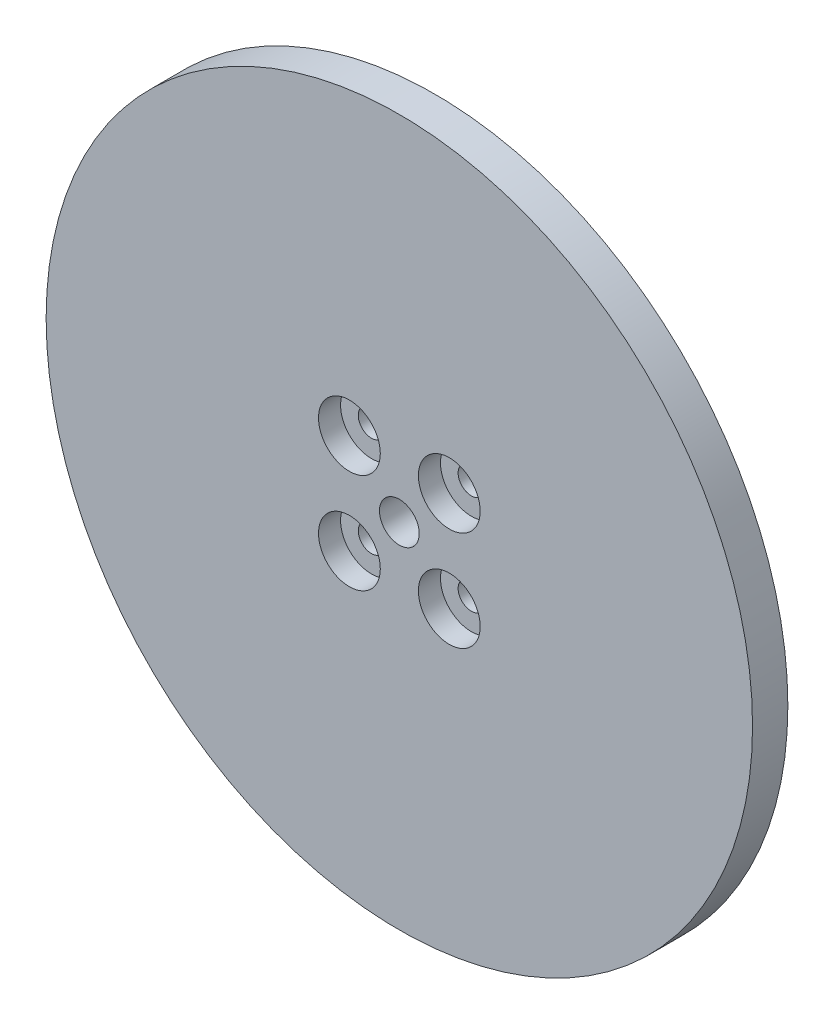
ISO-10303-21;
HEADER;
FILE_DESCRIPTION(('STEP AP214'),'2;1');
FILE_NAME('part.step','',(''),(''),'','','');
FILE_SCHEMA(('AUTOMOTIVE_DESIGN { 1 0 10303 214 1 1 1 1 }'));
ENDSEC;
DATA;
#1=APPLICATION_CONTEXT('core data for automotive mechanical design processes');
#2=APPLICATION_PROTOCOL_DEFINITION('international standard','automotive_design',2000,#1);
#3=PRODUCT_CONTEXT('',#1,'mechanical');
#4=PRODUCT('Part','Part','',(#3));
#5=PRODUCT_RELATED_PRODUCT_CATEGORY('part','',(#4));
#6=PRODUCT_DEFINITION_FORMATION('','',#4);
#7=PRODUCT_DEFINITION_CONTEXT('part definition',#1,'design');
#8=PRODUCT_DEFINITION('design','',#6,#7);
#9=PRODUCT_DEFINITION_SHAPE('','',#8);
#10=(LENGTH_UNIT() NAMED_UNIT(*) SI_UNIT(.MILLI.,.METRE.));
#11=(NAMED_UNIT(*) PLANE_ANGLE_UNIT() SI_UNIT($,.RADIAN.));
#12=(NAMED_UNIT(*) SI_UNIT($,.STERADIAN.) SOLID_ANGLE_UNIT());
#13=UNCERTAINTY_MEASURE_WITH_UNIT(LENGTH_MEASURE(1.E-05),#10,'distance_accuracy_value','');
#14=(GEOMETRIC_REPRESENTATION_CONTEXT(3) GLOBAL_UNCERTAINTY_ASSIGNED_CONTEXT((#13)) GLOBAL_UNIT_ASSIGNED_CONTEXT((#10,
#11,#12)) REPRESENTATION_CONTEXT('',''));
#15=CARTESIAN_POINT('',(0.,0.,0.));
#16=DIRECTION('',(0.,0.,1.));
#17=DIRECTION('',(1.,0.,0.));
#18=AXIS2_PLACEMENT_3D('',#15,#16,#17);
#19=CARTESIAN_POINT('',(-5.65599974191923,5.65770862800566,6.5));
#20=DIRECTION('',(0.,0.,-1.));
#21=DIRECTION('',(-1.,0.,0.));
#22=AXIS2_PLACEMENT_3D('',#19,#20,#21);
#23=CYLINDRICAL_SURFACE('',#22,1.5);
#24=CARTESIAN_POINT('',(-5.65599974191923,5.65770862800566,2.5));
#25=DIRECTION('',(0.,0.,1.));
#26=DIRECTION('',(1.,0.,0.));
#27=AXIS2_PLACEMENT_3D('',#24,#25,#26);
#28=CIRCLE('',#27,1.5);
#29=CARTESIAN_POINT('',(-4.15599974191923,5.65770862800566,2.5));
#30=VERTEX_POINT('',#29);
#31=EDGE_CURVE('E87',#30,#30,#28,.T.);
#32=ORIENTED_EDGE('',*,*,#31,.F.);
#33=EDGE_LOOP('',(#32));
#34=FACE_BOUND('',#33,.T.);
#35=CARTESIAN_POINT('',(-5.65599974191923,5.65770862800566,4.));
#36=DIRECTION('',(0.,0.,1.));
#37=DIRECTION('',(1.,0.,0.));
#38=AXIS2_PLACEMENT_3D('',#35,#36,#37);
#39=CIRCLE('',#38,1.5);
#40=CARTESIAN_POINT('',(-4.15599974191923,5.65770862800566,4.));
#41=VERTEX_POINT('',#40);
#42=EDGE_CURVE('E45',#41,#41,#39,.T.);
#43=ORIENTED_EDGE('',*,*,#42,.T.);
#44=EDGE_LOOP('',(#43));
#45=FACE_BOUND('',#44,.T.);
#46=ADVANCED_FACE('F41',(#34,#45),#23,.F.);
#47=CARTESIAN_POINT('',(-5.65599974191923,-5.65770862800566,6.5));
#48=DIRECTION('',(0.,0.,-1.));
#49=DIRECTION('',(-1.,0.,0.));
#50=AXIS2_PLACEMENT_3D('',#47,#48,#49);
#51=CYLINDRICAL_SURFACE('',#50,1.5);
#52=CARTESIAN_POINT('',(-5.65599974191923,-5.65770862800566,2.5));
#53=DIRECTION('',(0.,0.,1.));
#54=DIRECTION('',(1.,0.,0.));
#55=AXIS2_PLACEMENT_3D('',#52,#53,#54);
#56=CIRCLE('',#55,1.5);
#57=CARTESIAN_POINT('',(-4.15599974191923,-5.65770862800566,2.5));
#58=VERTEX_POINT('',#57);
#59=EDGE_CURVE('E79',#58,#58,#56,.T.);
#60=ORIENTED_EDGE('',*,*,#59,.F.);
#61=EDGE_LOOP('',(#60));
#62=FACE_BOUND('',#61,.T.);
#63=CARTESIAN_POINT('',(-5.65599974191923,-5.65770862800566,4.));
#64=DIRECTION('',(0.,0.,1.));
#65=DIRECTION('',(1.,0.,0.));
#66=AXIS2_PLACEMENT_3D('',#63,#64,#65);
#67=CIRCLE('',#66,1.5);
#68=CARTESIAN_POINT('',(-4.15599974191923,-5.65770862800566,4.));
#69=VERTEX_POINT('',#68);
#70=EDGE_CURVE('E65',#69,#69,#67,.T.);
#71=ORIENTED_EDGE('',*,*,#70,.T.);
#72=EDGE_LOOP('',(#71));
#73=FACE_BOUND('',#72,.T.);
#74=ADVANCED_FACE('F124',(#62,#73),#51,.F.);
#75=CARTESIAN_POINT('',(5.65599974191923,-5.65770862800566,6.5));
#76=DIRECTION('',(0.,0.,-1.));
#77=DIRECTION('',(-1.,0.,0.));
#78=AXIS2_PLACEMENT_3D('',#75,#76,#77);
#79=CYLINDRICAL_SURFACE('',#78,1.5);
#80=CARTESIAN_POINT('',(5.65599974191923,-5.65770862800566,2.5));
#81=DIRECTION('',(0.,0.,1.));
#82=DIRECTION('',(1.,0.,0.));
#83=AXIS2_PLACEMENT_3D('',#80,#81,#82);
#84=CIRCLE('',#83,1.5);
#85=CARTESIAN_POINT('',(7.15599974191923,-5.65770862800566,2.5));
#86=VERTEX_POINT('',#85);
#87=EDGE_CURVE('E74',#86,#86,#84,.T.);
#88=ORIENTED_EDGE('',*,*,#87,.F.);
#89=EDGE_LOOP('',(#88));
#90=FACE_BOUND('',#89,.T.);
#91=CARTESIAN_POINT('',(5.65599974191923,-5.65770862800566,4.));
#92=DIRECTION('',(0.,0.,1.));
#93=DIRECTION('',(1.,0.,0.));
#94=AXIS2_PLACEMENT_3D('',#91,#92,#93);
#95=CIRCLE('',#94,1.5);
#96=CARTESIAN_POINT('',(7.15599974191923,-5.65770862800566,4.));
#97=VERTEX_POINT('',#96);
#98=EDGE_CURVE('E62',#97,#97,#95,.T.);
#99=ORIENTED_EDGE('',*,*,#98,.T.);
#100=EDGE_LOOP('',(#99));
#101=FACE_BOUND('',#100,.T.);
#102=ADVANCED_FACE('F130',(#90,#101),#79,.F.);
#103=CARTESIAN_POINT('',(5.65599974191923,5.65770862800566,6.5));
#104=DIRECTION('',(0.,0.,-1.));
#105=DIRECTION('',(-1.,0.,0.));
#106=AXIS2_PLACEMENT_3D('',#103,#104,#105);
#107=CYLINDRICAL_SURFACE('',#106,1.5);
#108=CARTESIAN_POINT('',(5.65599974191923,5.65770862800566,2.5));
#109=DIRECTION('',(0.,0.,1.));
#110=DIRECTION('',(1.,0.,0.));
#111=AXIS2_PLACEMENT_3D('',#108,#109,#110);
#112=CIRCLE('',#111,1.5);
#113=CARTESIAN_POINT('',(7.15599974191923,5.65770862800566,2.5));
#114=VERTEX_POINT('',#113);
#115=EDGE_CURVE('E70',#114,#114,#112,.T.);
#116=ORIENTED_EDGE('',*,*,#115,.F.);
#117=EDGE_LOOP('',(#116));
#118=FACE_BOUND('',#117,.T.);
#119=CARTESIAN_POINT('',(5.65599974191923,5.65770862800566,4.));
#120=DIRECTION('',(0.,0.,1.));
#121=DIRECTION('',(1.,0.,0.));
#122=AXIS2_PLACEMENT_3D('',#119,#120,#121);
#123=CIRCLE('',#122,1.5);
#124=CARTESIAN_POINT('',(7.15599974191923,5.65770862800566,4.));
#125=VERTEX_POINT('',#124);
#126=EDGE_CURVE('E59',#125,#125,#123,.T.);
#127=ORIENTED_EDGE('',*,*,#126,.T.);
#128=EDGE_LOOP('',(#127));
#129=FACE_BOUND('',#128,.T.);
#130=ADVANCED_FACE('F284',(#118,#129),#107,.F.);
#131=CARTESIAN_POINT('',(0.,0.,0.));
#132=DIRECTION('',(0.,0.,1.));
#133=DIRECTION('',(1.,0.,0.));
#134=AXIS2_PLACEMENT_3D('',#131,#132,#133);
#135=PLANE('',#134);
#136=CARTESIAN_POINT('',(0.,0.,0.));
#137=DIRECTION('',(0.,0.,1.));
#138=DIRECTION('',(1.,0.,0.));
#139=AXIS2_PLACEMENT_3D('',#136,#137,#138);
#140=CIRCLE('',#139,25.);
#141=CARTESIAN_POINT('',(25.,0.,0.));
#142=VERTEX_POINT('',#141);
#143=EDGE_CURVE('E49',#142,#142,#140,.T.);
#144=ORIENTED_EDGE('',*,*,#143,.F.);
#145=EDGE_LOOP('',(#144));
#146=FACE_BOUND('',#145,.T.);
#147=CARTESIAN_POINT('',(0.,0.,0.));
#148=DIRECTION('',(0.,0.,1.));
#149=DIRECTION('',(1.,0.,0.));
#150=AXIS2_PLACEMENT_3D('',#147,#148,#149);
#151=CIRCLE('',#150,12.5);
#152=CARTESIAN_POINT('',(12.5,0.,0.));
#153=VERTEX_POINT('',#152);
#154=EDGE_CURVE('E54',#153,#153,#151,.T.);
#155=ORIENTED_EDGE('',*,*,#154,.T.);
#156=EDGE_LOOP('',(#155));
#157=FACE_BOUND('',#156,.T.);
#158=ADVANCED_FACE('F108',(#146,#157),#135,.F.);
#159=CARTESIAN_POINT('',(0.,0.,2.5));
#160=DIRECTION('',(0.,0.,-1.));
#161=DIRECTION('',(-1.,0.,0.));
#162=AXIS2_PLACEMENT_3D('',#159,#160,#161);
#163=CYLINDRICAL_SURFACE('',#162,25.);
#164=CARTESIAN_POINT('',(0.,0.,2.5));
#165=DIRECTION('',(0.,0.,1.));
#166=DIRECTION('',(1.,0.,0.));
#167=AXIS2_PLACEMENT_3D('',#164,#165,#166);
#168=CIRCLE('',#167,25.);
#169=CARTESIAN_POINT('',(25.,0.,2.5));
#170=VERTEX_POINT('',#169);
#171=EDGE_CURVE('E10',#170,#170,#168,.T.);
#172=ORIENTED_EDGE('',*,*,#171,.F.);
#173=EDGE_LOOP('',(#172));
#174=FACE_BOUND('',#173,.T.);
#175=ORIENTED_EDGE('',*,*,#143,.T.);
#176=EDGE_LOOP('',(#175));
#177=FACE_BOUND('',#176,.T.);
#178=ADVANCED_FACE('F43',(#174,#177),#163,.T.);
#179=CARTESIAN_POINT('',(0.,0.,2.5));
#180=DIRECTION('',(0.,0.,-1.));
#181=DIRECTION('',(-1.,0.,0.));
#182=AXIS2_PLACEMENT_3D('',#179,#180,#181);
#183=CYLINDRICAL_SURFACE('',#182,12.5);
#184=CARTESIAN_POINT('',(0.,0.,2.5));
#185=DIRECTION('',(0.,0.,1.));
#186=DIRECTION('',(1.,0.,0.));
#187=AXIS2_PLACEMENT_3D('',#184,#185,#186);
#188=CIRCLE('',#187,12.5);
#189=CARTESIAN_POINT('',(12.5,0.,2.5));
#190=VERTEX_POINT('',#189);
#191=EDGE_CURVE('E100',#190,#190,#188,.T.);
#192=ORIENTED_EDGE('',*,*,#191,.T.);
#193=EDGE_LOOP('',(#192));
#194=FACE_BOUND('',#193,.T.);
#195=ORIENTED_EDGE('',*,*,#154,.F.);
#196=EDGE_LOOP('',(#195));
#197=FACE_BOUND('',#196,.T.);
#198=ADVANCED_FACE('F110',(#194,#197),#183,.F.);
#199=CARTESIAN_POINT('',(0.,0.,2.5));
#200=DIRECTION('',(0.,0.,1.));
#201=DIRECTION('',(1.,0.,0.));
#202=AXIS2_PLACEMENT_3D('',#199,#200,#201);
#203=PLANE('',#202);
#204=ORIENTED_EDGE('',*,*,#115,.T.);
#205=EDGE_LOOP('',(#204));
#206=FACE_BOUND('',#205,.T.);
#207=ORIENTED_EDGE('',*,*,#87,.T.);
#208=EDGE_LOOP('',(#207));
#209=FACE_BOUND('',#208,.T.);
#210=ORIENTED_EDGE('',*,*,#59,.T.);
#211=EDGE_LOOP('',(#210));
#212=FACE_BOUND('',#211,.T.);
#213=ORIENTED_EDGE('',*,*,#31,.T.);
#214=EDGE_LOOP('',(#213));
#215=FACE_BOUND('',#214,.T.);
#216=CARTESIAN_POINT('',(0.,0.,2.5));
#217=DIRECTION('',(0.,0.,1.));
#218=DIRECTION('',(1.,0.,0.));
#219=AXIS2_PLACEMENT_3D('',#216,#217,#218);
#220=CIRCLE('',#219,2.25);
#221=CARTESIAN_POINT('',(2.25,0.,2.5));
#222=VERTEX_POINT('',#221);
#223=EDGE_CURVE('E90',#222,#222,#220,.T.);
#224=ORIENTED_EDGE('',*,*,#223,.T.);
#225=EDGE_LOOP('',(#224));
#226=FACE_BOUND('',#225,.T.);
#227=ORIENTED_EDGE('',*,*,#191,.F.);
#228=EDGE_LOOP('',(#227));
#229=FACE_BOUND('',#228,.T.);
#230=ADVANCED_FACE('F112',(#206,#209,#212,#215,#226,#229),#203,.F.);
#231=CARTESIAN_POINT('',(0.,0.,6.5));
#232=DIRECTION('',(0.,0.,1.));
#233=DIRECTION('',(1.,0.,0.));
#234=AXIS2_PLACEMENT_3D('',#231,#232,#233);
#235=PLANE('',#234);
#236=CARTESIAN_POINT('',(-5.65599974191923,-5.65770862800566,6.5));
#237=DIRECTION('',(0.,0.,1.));
#238=DIRECTION('',(1.,0.,0.));
#239=AXIS2_PLACEMENT_3D('',#236,#237,#238);
#240=CIRCLE('',#239,3.5);
#241=CARTESIAN_POINT('',(-2.15599974191923,-5.65770862800566,6.5));
#242=VERTEX_POINT('',#241);
#243=EDGE_CURVE('E403',#242,#242,#240,.T.);
#244=ORIENTED_EDGE('',*,*,#243,.F.);
#245=EDGE_LOOP('',(#244));
#246=FACE_BOUND('',#245,.T.);
#247=CARTESIAN_POINT('',(5.65599974191923,-5.65770862800566,6.5));
#248=DIRECTION('',(0.,0.,1.));
#249=DIRECTION('',(1.,0.,0.));
#250=AXIS2_PLACEMENT_3D('',#247,#248,#249);
#251=CIRCLE('',#250,3.5);
#252=CARTESIAN_POINT('',(9.15599974191923,-5.65770862800566,6.5));
#253=VERTEX_POINT('',#252);
#254=EDGE_CURVE('E402',#253,#253,#251,.T.);
#255=ORIENTED_EDGE('',*,*,#254,.F.);
#256=EDGE_LOOP('',(#255));
#257=FACE_BOUND('',#256,.T.);
#258=CARTESIAN_POINT('',(5.65599974191923,5.65770862800566,6.5));
#259=DIRECTION('',(0.,0.,1.));
#260=DIRECTION('',(1.,0.,0.));
#261=AXIS2_PLACEMENT_3D('',#258,#259,#260);
#262=CIRCLE('',#261,3.5);
#263=CARTESIAN_POINT('',(9.15599974191923,5.65770862800566,6.5));
#264=VERTEX_POINT('',#263);
#265=EDGE_CURVE('E418',#264,#264,#262,.T.);
#266=ORIENTED_EDGE('',*,*,#265,.F.);
#267=EDGE_LOOP('',(#266));
#268=FACE_BOUND('',#267,.T.);
#269=CARTESIAN_POINT('',(-5.65599974191923,5.65770862800566,6.5));
#270=DIRECTION('',(0.,0.,1.));
#271=DIRECTION('',(1.,0.,0.));
#272=AXIS2_PLACEMENT_3D('',#269,#270,#271);
#273=CIRCLE('',#272,3.5);
#274=CARTESIAN_POINT('',(-2.15599974191923,5.65770862800566,6.5));
#275=VERTEX_POINT('',#274);
#276=EDGE_CURVE('E82',#275,#275,#273,.T.);
#277=ORIENTED_EDGE('',*,*,#276,.F.);
#278=EDGE_LOOP('',(#277));
#279=FACE_BOUND('',#278,.T.);
#280=CARTESIAN_POINT('',(0.,0.,6.5));
#281=DIRECTION('',(0.,0.,1.));
#282=DIRECTION('',(1.,0.,0.));
#283=AXIS2_PLACEMENT_3D('',#280,#281,#282);
#284=CIRCLE('',#283,40.);
#285=CARTESIAN_POINT('',(40.,0.,6.5));
#286=VERTEX_POINT('',#285);
#287=EDGE_CURVE('E97',#286,#286,#284,.T.);
#288=ORIENTED_EDGE('',*,*,#287,.T.);
#289=EDGE_LOOP('',(#288));
#290=FACE_BOUND('',#289,.T.);
#291=CARTESIAN_POINT('',(0.,0.,6.5));
#292=DIRECTION('',(0.,0.,1.));
#293=DIRECTION('',(1.,0.,0.));
#294=AXIS2_PLACEMENT_3D('',#291,#292,#293);
#295=CIRCLE('',#294,2.25);
#296=CARTESIAN_POINT('',(2.25,0.,6.5));
#297=VERTEX_POINT('',#296);
#298=EDGE_CURVE('E91',#297,#297,#295,.T.);
#299=ORIENTED_EDGE('',*,*,#298,.F.);
#300=EDGE_LOOP('',(#299));
#301=FACE_BOUND('',#300,.T.);
#302=ADVANCED_FACE('F118',(#246,#257,#268,#279,#290,#301),#235,.T.);
#303=ORIENTED_EDGE('',*,*,#171,.T.);
#304=EDGE_LOOP('',(#303));
#305=FACE_BOUND('',#304,.T.);
#306=CARTESIAN_POINT('',(0.,0.,2.5));
#307=DIRECTION('',(0.,0.,1.));
#308=DIRECTION('',(1.,0.,0.));
#309=AXIS2_PLACEMENT_3D('',#306,#307,#308);
#310=CIRCLE('',#309,40.);
#311=CARTESIAN_POINT('',(40.,0.,2.5));
#312=VERTEX_POINT('',#311);
#313=EDGE_CURVE('E94',#312,#312,#310,.T.);
#314=ORIENTED_EDGE('',*,*,#313,.F.);
#315=EDGE_LOOP('',(#314));
#316=FACE_BOUND('',#315,.T.);
#317=ADVANCED_FACE('F120',(#305,#316),#203,.F.);
#318=CARTESIAN_POINT('',(0.,0.,6.5));
#319=DIRECTION('',(0.,0.,-1.));
#320=DIRECTION('',(-1.,0.,0.));
#321=AXIS2_PLACEMENT_3D('',#318,#319,#320);
#322=CYLINDRICAL_SURFACE('',#321,40.);
#323=ORIENTED_EDGE('',*,*,#287,.F.);
#324=EDGE_LOOP('',(#323));
#325=FACE_BOUND('',#324,.T.);
#326=ORIENTED_EDGE('',*,*,#313,.T.);
#327=EDGE_LOOP('',(#326));
#328=FACE_BOUND('',#327,.T.);
#329=ADVANCED_FACE('F140',(#325,#328),#322,.T.);
#330=CARTESIAN_POINT('',(0.,0.,6.5));
#331=DIRECTION('',(0.,0.,-1.));
#332=DIRECTION('',(-1.,0.,0.));
#333=AXIS2_PLACEMENT_3D('',#330,#331,#332);
#334=CYLINDRICAL_SURFACE('',#333,2.25);
#335=ORIENTED_EDGE('',*,*,#298,.T.);
#336=EDGE_LOOP('',(#335));
#337=FACE_BOUND('',#336,.T.);
#338=ORIENTED_EDGE('',*,*,#223,.F.);
#339=EDGE_LOOP('',(#338));
#340=FACE_BOUND('',#339,.T.);
#341=ADVANCED_FACE('F136',(#337,#340),#334,.F.);
#342=CARTESIAN_POINT('',(5.65599974191923,5.65770862800566,4.));
#343=DIRECTION('',(0.,0.,1.));
#344=DIRECTION('',(1.,0.,0.));
#345=AXIS2_PLACEMENT_3D('',#342,#343,#344);
#346=CYLINDRICAL_SURFACE('',#345,3.5);
#347=CARTESIAN_POINT('',(5.65599974191923,5.65770862800566,4.));
#348=DIRECTION('',(0.,0.,1.));
#349=DIRECTION('',(1.,0.,0.));
#350=AXIS2_PLACEMENT_3D('',#347,#348,#349);
#351=CIRCLE('',#350,3.5);
#352=CARTESIAN_POINT('',(9.15599974191923,5.65770862800566,4.));
#353=VERTEX_POINT('',#352);
#354=EDGE_CURVE('E406',#353,#353,#351,.T.);
#355=ORIENTED_EDGE('',*,*,#354,.F.);
#356=EDGE_LOOP('',(#355));
#357=FACE_BOUND('',#356,.T.);
#358=ORIENTED_EDGE('',*,*,#265,.T.);
#359=EDGE_LOOP('',(#358));
#360=FACE_BOUND('',#359,.T.);
#361=ADVANCED_FACE('F139',(#357,#360),#346,.F.);
#362=CARTESIAN_POINT('',(5.65599974191923,5.65770862800566,4.));
#363=DIRECTION('',(0.,0.,1.));
#364=DIRECTION('',(1.,0.,0.));
#365=AXIS2_PLACEMENT_3D('',#362,#363,#364);
#366=PLANE('',#365);
#367=ORIENTED_EDGE('',*,*,#126,.F.);
#368=EDGE_LOOP('',(#367));
#369=FACE_BOUND('',#368,.T.);
#370=ORIENTED_EDGE('',*,*,#354,.T.);
#371=EDGE_LOOP('',(#370));
#372=FACE_BOUND('',#371,.T.);
#373=ADVANCED_FACE('F172',(#369,#372),#366,.T.);
#374=CARTESIAN_POINT('',(5.65599974191923,-5.65770862800566,4.));
#375=DIRECTION('',(0.,0.,1.));
#376=DIRECTION('',(1.,0.,0.));
#377=AXIS2_PLACEMENT_3D('',#374,#375,#376);
#378=CYLINDRICAL_SURFACE('',#377,3.5);
#379=CARTESIAN_POINT('',(5.65599974191923,-5.65770862800566,4.));
#380=DIRECTION('',(0.,0.,1.));
#381=DIRECTION('',(1.,0.,0.));
#382=AXIS2_PLACEMENT_3D('',#379,#380,#381);
#383=CIRCLE('',#382,3.5);
#384=CARTESIAN_POINT('',(9.15599974191923,-5.65770862800566,4.));
#385=VERTEX_POINT('',#384);
#386=EDGE_CURVE('E401',#385,#385,#383,.T.);
#387=ORIENTED_EDGE('',*,*,#386,.F.);
#388=EDGE_LOOP('',(#387));
#389=FACE_BOUND('',#388,.T.);
#390=ORIENTED_EDGE('',*,*,#254,.T.);
#391=EDGE_LOOP('',(#390));
#392=FACE_BOUND('',#391,.T.);
#393=ADVANCED_FACE('F180',(#389,#392),#378,.F.);
#394=CARTESIAN_POINT('',(5.65599974191923,-5.65770862800566,4.));
#395=DIRECTION('',(0.,0.,1.));
#396=DIRECTION('',(1.,0.,0.));
#397=AXIS2_PLACEMENT_3D('',#394,#395,#396);
#398=PLANE('',#397);
#399=ORIENTED_EDGE('',*,*,#98,.F.);
#400=EDGE_LOOP('',(#399));
#401=FACE_BOUND('',#400,.T.);
#402=ORIENTED_EDGE('',*,*,#386,.T.);
#403=EDGE_LOOP('',(#402));
#404=FACE_BOUND('',#403,.T.);
#405=ADVANCED_FACE('F188',(#401,#404),#398,.T.);
#406=CARTESIAN_POINT('',(-5.65599974191923,-5.65770862800566,4.));
#407=DIRECTION('',(0.,0.,1.));
#408=DIRECTION('',(1.,0.,0.));
#409=AXIS2_PLACEMENT_3D('',#406,#407,#408);
#410=CYLINDRICAL_SURFACE('',#409,3.5);
#411=CARTESIAN_POINT('',(-5.65599974191923,-5.65770862800566,4.));
#412=DIRECTION('',(0.,0.,1.));
#413=DIRECTION('',(1.,0.,0.));
#414=AXIS2_PLACEMENT_3D('',#411,#412,#413);
#415=CIRCLE('',#414,3.5);
#416=CARTESIAN_POINT('',(-2.15599974191923,-5.65770862800566,4.));
#417=VERTEX_POINT('',#416);
#418=EDGE_CURVE('E409',#417,#417,#415,.T.);
#419=ORIENTED_EDGE('',*,*,#418,.F.);
#420=EDGE_LOOP('',(#419));
#421=FACE_BOUND('',#420,.T.);
#422=ORIENTED_EDGE('',*,*,#243,.T.);
#423=EDGE_LOOP('',(#422));
#424=FACE_BOUND('',#423,.T.);
#425=ADVANCED_FACE('F196',(#421,#424),#410,.F.);
#426=CARTESIAN_POINT('',(-5.65599974191923,-5.65770862800566,4.));
#427=DIRECTION('',(0.,0.,1.));
#428=DIRECTION('',(1.,0.,0.));
#429=AXIS2_PLACEMENT_3D('',#426,#427,#428);
#430=PLANE('',#429);
#431=ORIENTED_EDGE('',*,*,#70,.F.);
#432=EDGE_LOOP('',(#431));
#433=FACE_BOUND('',#432,.T.);
#434=ORIENTED_EDGE('',*,*,#418,.T.);
#435=EDGE_LOOP('',(#434));
#436=FACE_BOUND('',#435,.T.);
#437=ADVANCED_FACE('F204',(#433,#436),#430,.T.);
#438=CARTESIAN_POINT('',(-5.65599974191923,5.65770862800566,4.));
#439=DIRECTION('',(0.,0.,1.));
#440=DIRECTION('',(1.,0.,0.));
#441=AXIS2_PLACEMENT_3D('',#438,#439,#440);
#442=CYLINDRICAL_SURFACE('',#441,3.5);
#443=CARTESIAN_POINT('',(-5.65599974191923,5.65770862800566,4.));
#444=DIRECTION('',(0.,0.,1.));
#445=DIRECTION('',(1.,0.,0.));
#446=AXIS2_PLACEMENT_3D('',#443,#444,#445);
#447=CIRCLE('',#446,3.5);
#448=CARTESIAN_POINT('',(-2.15599974191923,5.65770862800566,4.));
#449=VERTEX_POINT('',#448);
#450=EDGE_CURVE('E63',#449,#449,#447,.T.);
#451=ORIENTED_EDGE('',*,*,#450,.F.);
#452=EDGE_LOOP('',(#451));
#453=FACE_BOUND('',#452,.T.);
#454=ORIENTED_EDGE('',*,*,#276,.T.);
#455=EDGE_LOOP('',(#454));
#456=FACE_BOUND('',#455,.T.);
#457=ADVANCED_FACE('F212',(#453,#456),#442,.F.);
#458=CARTESIAN_POINT('',(-5.65599974191923,5.65770862800566,4.));
#459=DIRECTION('',(0.,0.,1.));
#460=DIRECTION('',(1.,0.,0.));
#461=AXIS2_PLACEMENT_3D('',#458,#459,#460);
#462=PLANE('',#461);
#463=ORIENTED_EDGE('',*,*,#42,.F.);
#464=EDGE_LOOP('',(#463));
#465=FACE_BOUND('',#464,.T.);
#466=ORIENTED_EDGE('',*,*,#450,.T.);
#467=EDGE_LOOP('',(#466));
#468=FACE_BOUND('',#467,.T.);
#469=ADVANCED_FACE('F220',(#465,#468),#462,.T.);
#470=CLOSED_SHELL('',(#46,#74,#102,#130,#158,#178,#198,#230,#302,#317,#329,#341,#361,#373,#393,
#405,#425,#437,#457,#469));
#471=MANIFOLD_SOLID_BREP('B2',#470);
#472=ADVANCED_BREP_SHAPE_REPRESENTATION('',(#18,#471),#14);
#473=SHAPE_DEFINITION_REPRESENTATION(#9,#472);
ENDSEC;
END-ISO-10303-21;
